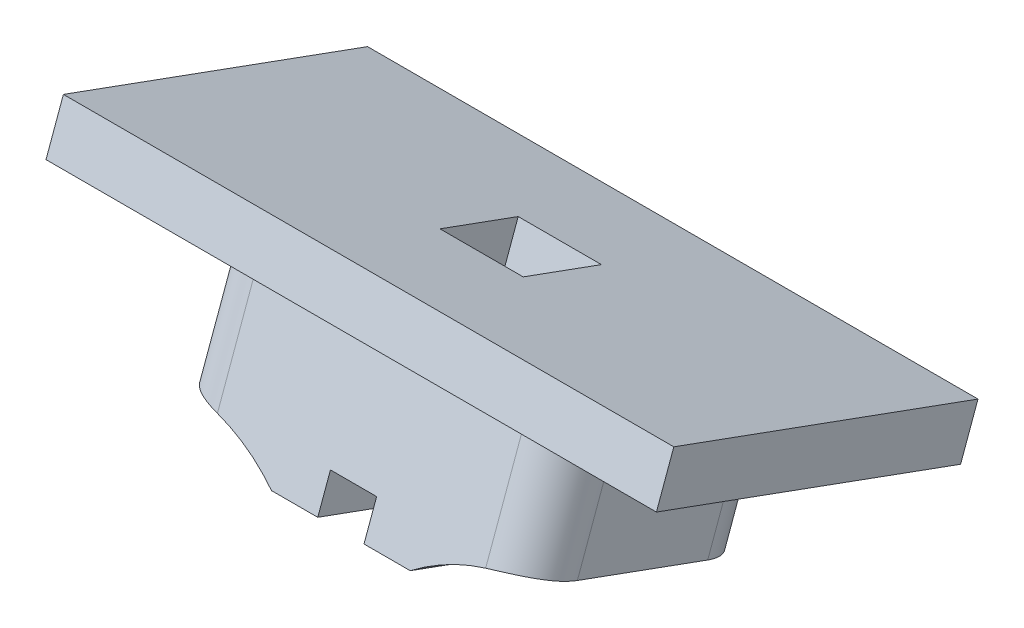
ISO-10303-21;
HEADER;
FILE_DESCRIPTION(('STEP AP214'),'2;1');
FILE_NAME('part.step','',(''),(''),'','','');
FILE_SCHEMA(('AUTOMOTIVE_DESIGN { 1 0 10303 214 1 1 1 1 }'));
ENDSEC;
DATA;
#1=APPLICATION_CONTEXT('core data for automotive mechanical design processes');
#2=APPLICATION_PROTOCOL_DEFINITION('international standard','automotive_design',2000,#1);
#3=PRODUCT_CONTEXT('',#1,'mechanical');
#4=PRODUCT('Part','Part','',(#3));
#5=PRODUCT_RELATED_PRODUCT_CATEGORY('part','',(#4));
#6=PRODUCT_DEFINITION_FORMATION('','',#4);
#7=PRODUCT_DEFINITION_CONTEXT('part definition',#1,'design');
#8=PRODUCT_DEFINITION('design','',#6,#7);
#9=PRODUCT_DEFINITION_SHAPE('','',#8);
#10=(LENGTH_UNIT() NAMED_UNIT(*) SI_UNIT(.MILLI.,.METRE.));
#11=(NAMED_UNIT(*) PLANE_ANGLE_UNIT() SI_UNIT($,.RADIAN.));
#12=(NAMED_UNIT(*) SI_UNIT($,.STERADIAN.) SOLID_ANGLE_UNIT());
#13=UNCERTAINTY_MEASURE_WITH_UNIT(LENGTH_MEASURE(1.E-05),#10,'distance_accuracy_value','');
#14=(GEOMETRIC_REPRESENTATION_CONTEXT(3) GLOBAL_UNCERTAINTY_ASSIGNED_CONTEXT((#13)) GLOBAL_UNIT_ASSIGNED_CONTEXT((#10,
#11,#12)) REPRESENTATION_CONTEXT('',''));
#15=CARTESIAN_POINT('',(0.,0.,0.));
#16=DIRECTION('',(0.,0.,1.));
#17=DIRECTION('',(1.,0.,0.));
#18=AXIS2_PLACEMENT_3D('',#15,#16,#17);
#19=CARTESIAN_POINT('',(-3.9,-153.349598056909,40.7816311231311));
#20=DIRECTION('',(0.,-0.34202014332567,-0.939692620785908));
#21=DIRECTION('',(0.,0.939692620785908,-0.34202014332567));
#22=AXIS2_PLACEMENT_3D('',#19,#20,#21);
#23=PLANE('',#22);
#24=CARTESIAN_POINT('',(2.90000000000001,-145.770988480469,38.0232428201822));
#25=DIRECTION('',(0.,-0.34202014332567,-0.939692620785908));
#26=DIRECTION('',(0.,0.939692620785908,-0.34202014332567));
#27=AXIS2_PLACEMENT_3D('',#24,#25,#26);
#28=CIRCLE('',#27,4.00000000000002);
#29=CARTESIAN_POINT('',(1.90000000000001,-142.131574609611,36.6986045010144));
#30=VERTEX_POINT('',#29);
#31=CARTESIAN_POINT('',(0.500000000000057,-142.763972093954,36.92877836154));
#32=VERTEX_POINT('',#31);
#33=EDGE_CURVE('E63',#30,#32,#28,.F.);
#34=ORIENTED_EDGE('',*,*,#33,.F.);
#35=DIRECTION('',(0.,0.939692620785908,-0.34202014332567));
#36=VECTOR('',#35,1.);
#37=CARTESIAN_POINT('',(1.90000000000001,-153.349598056909,40.7816311231311));
#38=LINE('',#37,#36);
#39=CARTESIAN_POINT('',(1.90000000000001,-139.569017183282,35.7659098742328));
#40=VERTEX_POINT('',#39);
#41=EDGE_CURVE('E368',#30,#40,#38,.T.);
#42=ORIENTED_EDGE('',*,*,#41,.T.);
#43=DIRECTION('',(-1.,0.,0.));
#44=VECTOR('',#43,1.);
#45=CARTESIAN_POINT('',(-3.9,-139.569017183282,35.7659098742328));
#46=LINE('',#45,#44);
#47=CARTESIAN_POINT('',(-3.9,-139.569017183282,35.7659098742328));
#48=VERTEX_POINT('',#47);
#49=EDGE_CURVE('E456',#40,#48,#46,.T.);
#50=ORIENTED_EDGE('',*,*,#49,.T.);
#51=DIRECTION('',(0.,0.939692620785908,-0.34202014332567));
#52=VECTOR('',#51,1.);
#53=CARTESIAN_POINT('',(-3.9,-153.349598056909,40.7816311231311));
#54=LINE('',#53,#52);
#55=CARTESIAN_POINT('',(-3.9,-142.131574609611,36.6986045010144));
#56=VERTEX_POINT('',#55);
#57=EDGE_CURVE('E459',#56,#48,#54,.T.);
#58=ORIENTED_EDGE('',*,*,#57,.F.);
#59=CARTESIAN_POINT('',(-4.9,-145.770988480469,38.0232428201822));
#60=DIRECTION('',(0.,-0.34202014332567,-0.939692620785908));
#61=DIRECTION('',(0.,0.939692620785908,-0.34202014332567));
#62=AXIS2_PLACEMENT_3D('',#59,#60,#61);
#63=CIRCLE('',#62,4.00000000000002);
#64=CARTESIAN_POINT('',(-2.5,-142.763972093954,36.92877836154));
#65=VERTEX_POINT('',#64);
#66=EDGE_CURVE('E297',#56,#65,#63,.T.);
#67=ORIENTED_EDGE('',*,*,#66,.T.);
#68=DIRECTION('',(1.,0.,0.));
#69=VECTOR('',#68,1.);
#70=CARTESIAN_POINT('',(-3.9,-142.763972093954,36.92877836154));
#71=LINE('',#70,#69);
#72=CARTESIAN_POINT('',(-1.5,-142.763972093954,36.9287783615401));
#73=VERTEX_POINT('',#72);
#74=EDGE_CURVE('E380',#65,#73,#71,.T.);
#75=ORIENTED_EDGE('',*,*,#74,.T.);
#76=DIRECTION('',(0.,0.939692620785908,-0.34202014332567));
#77=VECTOR('',#76,1.);
#78=CARTESIAN_POINT('',(-1.50000000000001,-153.349598056909,40.7816311231311));
#79=LINE('',#78,#77);
#80=CARTESIAN_POINT('',(-1.5,-142.012217997325,36.6551622468795));
#81=VERTEX_POINT('',#80);
#82=EDGE_CURVE('E430',#73,#81,#79,.T.);
#83=ORIENTED_EDGE('',*,*,#82,.T.);
#84=DIRECTION('',(1.,0.,0.));
#85=VECTOR('',#84,1.);
#86=CARTESIAN_POINT('',(-3.9,-142.012217997325,36.6551622468795));
#87=LINE('',#86,#85);
#88=CARTESIAN_POINT('',(-0.499999999999999,-142.012217997325,36.6551622468795));
#89=VERTEX_POINT('',#88);
#90=EDGE_CURVE('E437',#81,#89,#87,.T.);
#91=ORIENTED_EDGE('',*,*,#90,.T.);
#92=DIRECTION('',(0.,-0.939692620785908,0.34202014332567));
#93=VECTOR('',#92,1.);
#94=CARTESIAN_POINT('',(-0.499999999999995,-153.349598056909,40.7816311231311));
#95=LINE('',#94,#93);
#96=CARTESIAN_POINT('',(-0.499999999999998,-142.763972093954,36.9287783615401));
#97=VERTEX_POINT('',#96);
#98=EDGE_CURVE('E296',#89,#97,#95,.T.);
#99=ORIENTED_EDGE('',*,*,#98,.T.);
#100=EDGE_CURVE('E377',#97,#32,#71,.T.);
#101=ORIENTED_EDGE('',*,*,#100,.T.);
#102=EDGE_LOOP('',(#34,#42,#50,#58,#67,#75,#83,#91,#99,#101));
#103=FACE_BOUND('',#102,.T.);
#104=ADVANCED_FACE('F41',(#103),#23,.F.);
#105=CARTESIAN_POINT('',(1.90000000000001,-153.691618200234,39.8419385023452));
#106=DIRECTION('',(0.,0.939692620785908,-0.34202014332567));
#107=DIRECTION('',(0.,0.34202014332567,0.939692620785908));
#108=AXIS2_PLACEMENT_3D('',#105,#106,#107);
#109=CYLINDRICAL_SURFACE('',#108,1.);
#110=CARTESIAN_POINT('',(2.90000000000001,-142.354238140651,35.7154696260936));
#111=CARTESIAN_POINT('',(2.89999981067585,-142.344623044675,35.7418918722339));
#112=CARTESIAN_POINT('',(2.89881337849548,-142.335009168218,35.7683002326536));
#113=CARTESIAN_POINT('',(2.89408019371542,-142.315856981499,35.8209307834219));
#114=CARTESIAN_POINT('',(2.8905335481238,-142.30631866783,35.8471529821564));
#115=CARTESIAN_POINT('',(2.87638591533363,-142.277954590061,35.9252261233121));
#116=CARTESIAN_POINT('',(2.86227714579942,-142.259349628695,35.9765659550263));
#117=CARTESIAN_POINT('',(2.82509671773204,-142.223563914469,36.0764199066002));
#118=CARTESIAN_POINT('',(2.80202045019631,-142.206383899503,36.124932558613));
#119=CARTESIAN_POINT('',(2.74756694703173,-142.174361576664,36.217901329455));
#120=CARTESIAN_POINT('',(2.71619110317607,-142.159518877507,36.2623581267394));
#121=CARTESIAN_POINT('',(2.64614645015715,-142.133155653353,36.3460164020395));
#122=CARTESIAN_POINT('',(2.60749690530354,-142.121626551658,36.3852313043284));
#123=CARTESIAN_POINT('',(2.52401346901969,-142.102730718085,36.4576186109335));
#124=CARTESIAN_POINT('',(2.4791799688056,-142.095363723048,36.4907913971849));
#125=CARTESIAN_POINT('',(2.38523587109286,-142.085579727483,36.5500366389209));
#126=CARTESIAN_POINT('',(2.33617599267395,-142.083110769194,36.576181051631));
#127=CARTESIAN_POINT('',(2.23488763670893,-142.08343503558,36.6213336855982));
#128=CARTESIAN_POINT('',(2.18265966895903,-142.086227415784,36.6403430514785));
#129=CARTESIAN_POINT('',(2.0917830755058,-142.09565041477,36.6665982206708));
#130=CARTESIAN_POINT('',(2.05350236945471,-142.100961728845,36.6756523621945));
#131=CARTESIAN_POINT('',(1.97676571960946,-142.114272303601,36.6899632965396));
#132=CARTESIAN_POINT('',(1.93831017303452,-142.122267080157,36.6952263784519));
#133=CARTESIAN_POINT('',(1.90000000000001,-142.131574609611,36.6986045010144));
#134=B_SPLINE_CURVE_WITH_KNOTS('',3,(#110,#111,#112,#113,#114,#115,#116,#117,#118,#119,#120,
#121,#122,#123,#124,#125,#126,#127,#128,#129,#130,#131,#132,#133),.UNSPECIFIED.,.F.,.F.,(4,2,2,
2,2,2,2,2,2,2,2,4),(0.,0.0843002674018228,0.168596713033013,0.336929968455124,0.50534985637378,
0.673741519496261,0.841693320533725,1.00963450128944,1.17578444895358,1.34190773099849,
1.46072884894646,1.57935239450491),.UNSPECIFIED.);
#135=CARTESIAN_POINT('',(2.90000000000001,-142.354238140651,35.7154696260936));
#136=VERTEX_POINT('',#135);
#137=EDGE_CURVE('E238',#136,#30,#134,.T.);
#138=ORIENTED_EDGE('',*,*,#137,.F.);
#139=DIRECTION('',(0.,0.939692620785908,-0.34202014332567));
#140=VECTOR('',#139,1.);
#141=CARTESIAN_POINT('',(2.90000000000001,-153.691618200234,39.8419385023452));
#142=LINE('',#141,#140);
#143=CARTESIAN_POINT('',(2.90000000000001,-139.911037326607,34.8262172534469));
#144=VERTEX_POINT('',#143);
#145=EDGE_CURVE('E357',#136,#144,#142,.T.);
#146=ORIENTED_EDGE('',*,*,#145,.T.);
#147=CARTESIAN_POINT('',(1.90000000000001,-139.911037326607,34.8262172534469));
#148=DIRECTION('',(0.,-0.939692620785908,0.34202014332567));
#149=DIRECTION('',(0.,-0.34202014332567,-0.939692620785908));
#150=AXIS2_PLACEMENT_3D('',#147,#148,#149);
#151=CIRCLE('',#150,1.);
#152=EDGE_CURVE('E453',#144,#40,#151,.T.);
#153=ORIENTED_EDGE('',*,*,#152,.T.);
#154=ORIENTED_EDGE('',*,*,#41,.F.);
#155=EDGE_LOOP('',(#138,#146,#153,#154));
#156=FACE_BOUND('',#155,.T.);
#157=ADVANCED_FACE('F336',(#156),#109,.T.);
#158=CARTESIAN_POINT('',(2.90000000000001,-153.691618200234,39.8419385023452));
#159=DIRECTION('',(-1.,0.,0.));
#160=DIRECTION('',(0.,0.,1.));
#161=AXIS2_PLACEMENT_3D('',#158,#159,#160);
#162=PLANE('',#161);
#163=DIRECTION('',(0.,-0.34202014332567,-0.939692620785908));
#164=VECTOR('',#163,1.);
#165=CARTESIAN_POINT('',(2.90000000000001,-141.477555042393,38.1241366425749));
#166=LINE('',#165,#164);
#167=CARTESIAN_POINT('',(2.90000000000001,-143.380298570628,32.8963917637359));
#168=VERTEX_POINT('',#167);
#169=EDGE_CURVE('E227',#136,#168,#166,.T.);
#170=ORIENTED_EDGE('',*,*,#169,.T.);
#171=DIRECTION('',(0.,0.939692620785908,-0.34202014332567));
#172=VECTOR('',#171,1.);
#173=CARTESIAN_POINT('',(2.90000000000001,-154.717678630211,37.0228606399875));
#174=LINE('',#173,#172);
#175=CARTESIAN_POINT('',(2.90000000000001,-140.937097756584,32.0071393910891));
#176=VERTEX_POINT('',#175);
#177=EDGE_CURVE('E355',#168,#176,#174,.T.);
#178=ORIENTED_EDGE('',*,*,#177,.T.);
#179=DIRECTION('',(0.,0.342020143325671,0.939692620785907));
#180=VECTOR('',#179,1.);
#181=CARTESIAN_POINT('',(2.90000000000001,-139.911037326607,34.8262172534469));
#182=LINE('',#181,#180);
#183=EDGE_CURVE('E451',#176,#144,#182,.T.);
#184=ORIENTED_EDGE('',*,*,#183,.T.);
#185=ORIENTED_EDGE('',*,*,#145,.F.);
#186=EDGE_LOOP('',(#170,#178,#184,#185));
#187=FACE_BOUND('',#186,.T.);
#188=ADVANCED_FACE('F342',(#187),#162,.F.);
#189=CARTESIAN_POINT('',(1.90000000000001,-154.717678630211,37.0228606399875));
#190=DIRECTION('',(0.,0.939692620785908,-0.34202014332567));
#191=DIRECTION('',(0.,0.34202014332567,0.939692620785908));
#192=AXIS2_PLACEMENT_3D('',#189,#190,#191);
#193=CYLINDRICAL_SURFACE('',#192,1.);
#194=CARTESIAN_POINT('',(1.90000000000001,-143.841675326239,32.0001413970849));
#195=CARTESIAN_POINT('',(1.92716067009067,-143.83508392531,31.9977425120358));
#196=CARTESIAN_POINT('',(1.95438533042163,-143.828387941829,31.9964836997612));
#197=CARTESIAN_POINT('',(2.00879893691792,-143.814802781268,31.9962784311637));
#198=CARTESIAN_POINT('',(2.0359878772083,-143.807913575772,31.9973323167238));
#199=CARTESIAN_POINT('',(2.1171772694028,-143.787000096474,32.0040064801178));
#200=CARTESIAN_POINT('',(2.17086742578389,-143.772713783152,32.0131332563838));
#201=CARTESIAN_POINT('',(2.27572285092795,-143.743548629488,32.0406309445279));
#202=CARTESIAN_POINT('',(2.32688435389645,-143.7286689617,32.0590152130967));
#203=CARTESIAN_POINT('',(2.4249810948888,-143.698329195005,32.1044687171173));
#204=CARTESIAN_POINT('',(2.47191843255582,-143.682869389933,32.1315336069465));
#205=CARTESIAN_POINT('',(2.5593953571267,-143.651544592773,32.1929272425316));
#206=CARTESIAN_POINT('',(2.60002532695292,-143.635690047798,32.2271327800724));
#207=CARTESIAN_POINT('',(2.67458868732341,-143.603244865591,32.3019242119346));
#208=CARTESIAN_POINT('',(2.70851996169044,-143.58665399777,32.3425121152503));
#209=CARTESIAN_POINT('',(2.76889693721068,-143.552572302368,32.4290197344405));
#210=CARTESIAN_POINT('',(2.79529159893002,-143.535076244316,32.4749729669177));
#211=CARTESIAN_POINT('',(2.8395424826282,-143.499321395764,32.5705354506616));
#212=CARTESIAN_POINT('',(2.85740240658892,-143.481062939701,32.620143106009));
#213=CARTESIAN_POINT('',(2.88045893625186,-143.449024339337,32.7076735739526));
#214=CARTESIAN_POINT('',(2.88777930261012,-143.435378201366,32.7451009183088));
#215=CARTESIAN_POINT('',(2.89755144145266,-143.407928219864,32.8204800453695));
#216=CARTESIAN_POINT('',(2.90000870819365,-143.394124572045,32.8584311874049));
#217=CARTESIAN_POINT('',(2.90000000000001,-143.380298570628,32.8963917637359));
#218=B_SPLINE_CURVE_WITH_KNOTS('',3,(#194,#195,#196,#197,#198,#199,#200,#201,#202,#203,#204,
#205,#206,#207,#208,#209,#210,#211,#212,#213,#214,#215,#216,#217),.UNSPECIFIED.,.F.,.F.,(4,2,2,
2,2,2,2,2,2,2,2,4),(0.,0.0841086974099779,0.16822982933487,0.336266736171334,0.504546783958135,
0.672742719892193,0.838246322843008,1.00380212647673,1.17045386616259,1.33703325412681,
1.45826418447112,1.57935807156958),.UNSPECIFIED.);
#219=CARTESIAN_POINT('',(1.90000000000001,-143.841675326239,32.0001413970849));
#220=VERTEX_POINT('',#219);
#221=EDGE_CURVE('E230',#220,#168,#218,.T.);
#222=ORIENTED_EDGE('',*,*,#221,.F.);
#223=DIRECTION('',(0.,0.939692620785908,-0.34202014332567));
#224=VECTOR('',#223,1.);
#225=CARTESIAN_POINT('',(1.90000000000001,-155.059698773537,36.0831680192016));
#226=LINE('',#225,#224);
#227=CARTESIAN_POINT('',(1.90000000000001,-141.27911789991,31.0674467703032));
#228=VERTEX_POINT('',#227);
#229=EDGE_CURVE('E364',#220,#228,#226,.T.);
#230=ORIENTED_EDGE('',*,*,#229,.T.);
#231=CARTESIAN_POINT('',(1.90000000000001,-140.937097756584,32.0071393910891));
#232=DIRECTION('',(0.,-0.939692620785908,0.34202014332567));
#233=DIRECTION('',(0.,-0.34202014332567,-0.939692620785908));
#234=AXIS2_PLACEMENT_3D('',#231,#232,#233);
#235=CIRCLE('',#234,1.);
#236=EDGE_CURVE('E362',#228,#176,#235,.T.);
#237=ORIENTED_EDGE('',*,*,#236,.T.);
#238=ORIENTED_EDGE('',*,*,#177,.F.);
#239=EDGE_LOOP('',(#222,#230,#237,#238));
#240=FACE_BOUND('',#239,.T.);
#241=ADVANCED_FACE('F245',(#240),#193,.T.);
#242=CARTESIAN_POINT('',(-3.9,-155.059698773537,36.0831680192016));
#243=DIRECTION('',(0.,0.34202014332567,0.939692620785908));
#244=DIRECTION('',(0.,-0.939692620785908,0.34202014332567));
#245=AXIS2_PLACEMENT_3D('',#242,#243,#244);
#246=PLANE('',#245);
#247=CARTESIAN_POINT('',(2.90000000000001,-147.481089197097,33.3247797162527));
#248=DIRECTION('',(0.,0.34202014332567,0.939692620785908));
#249=DIRECTION('',(0.,0.939692620785908,-0.34202014332567));
#250=AXIS2_PLACEMENT_3D('',#247,#248,#249);
#251=CIRCLE('',#250,4.00000000000002);
#252=CARTESIAN_POINT('',(0.500000000000004,-144.474072810582,32.2303152576105));
#253=VERTEX_POINT('',#252);
#254=EDGE_CURVE('E223',#220,#253,#251,.T.);
#255=ORIENTED_EDGE('',*,*,#254,.T.);
#256=DIRECTION('',(-1.,0.,0.));
#257=VECTOR('',#256,1.);
#258=CARTESIAN_POINT('',(-3.9,-144.474072810582,32.2303152576105));
#259=LINE('',#258,#257);
#260=CARTESIAN_POINT('',(-0.5,-144.474072810582,32.2303152576105));
#261=VERTEX_POINT('',#260);
#262=EDGE_CURVE('E414',#253,#261,#259,.T.);
#263=ORIENTED_EDGE('',*,*,#262,.T.);
#264=DIRECTION('',(0.,-0.939692620785904,0.342020143325681));
#265=VECTOR('',#264,1.);
#266=CARTESIAN_POINT('',(-0.499999999999998,-144.474072810582,32.2303152576105));
#267=LINE('',#266,#265);
#268=CARTESIAN_POINT('',(-0.499999999999999,-143.722318713953,31.95669914295));
#269=VERTEX_POINT('',#268);
#270=EDGE_CURVE('E477',#269,#261,#267,.T.);
#271=ORIENTED_EDGE('',*,*,#270,.F.);
#272=DIRECTION('',(1.,0.,0.));
#273=VECTOR('',#272,1.);
#274=CARTESIAN_POINT('',(-1.5,-143.722318713953,31.95669914295));
#275=LINE('',#274,#273);
#276=CARTESIAN_POINT('',(-1.5,-143.722318713953,31.95669914295));
#277=VERTEX_POINT('',#276);
#278=EDGE_CURVE('E485',#277,#269,#275,.T.);
#279=ORIENTED_EDGE('',*,*,#278,.F.);
#280=DIRECTION('',(0.,0.939692620785904,-0.342020143325681));
#281=VECTOR('',#280,1.);
#282=CARTESIAN_POINT('',(-1.5,-144.474072810582,32.2303152576105));
#283=LINE('',#282,#281);
#284=CARTESIAN_POINT('',(-1.5,-144.474072810582,32.2303152576105));
#285=VERTEX_POINT('',#284);
#286=EDGE_CURVE('E484',#285,#277,#283,.T.);
#287=ORIENTED_EDGE('',*,*,#286,.F.);
#288=CARTESIAN_POINT('',(-2.5,-144.474072810582,32.2303152576105));
#289=VERTEX_POINT('',#288);
#290=EDGE_CURVE('E424',#285,#289,#259,.T.);
#291=ORIENTED_EDGE('',*,*,#290,.T.);
#292=CARTESIAN_POINT('',(-4.9,-147.481089197097,33.3247797162527));
#293=DIRECTION('',(0.,-0.34202014332567,-0.939692620785908));
#294=DIRECTION('',(0.,0.939692620785908,-0.34202014332567));
#295=AXIS2_PLACEMENT_3D('',#292,#293,#294);
#296=CIRCLE('',#295,4.00000000000002);
#297=CARTESIAN_POINT('',(-3.9,-143.841675326239,32.0001413970849));
#298=VERTEX_POINT('',#297);
#299=EDGE_CURVE('E483',#298,#289,#296,.T.);
#300=ORIENTED_EDGE('',*,*,#299,.F.);
#301=DIRECTION('',(0.,0.939692620785908,-0.34202014332567));
#302=VECTOR('',#301,1.);
#303=CARTESIAN_POINT('',(-3.9,-155.059698773537,36.0831680192016));
#304=LINE('',#303,#302);
#305=CARTESIAN_POINT('',(-3.9,-141.27911789991,31.0674467703032));
#306=VERTEX_POINT('',#305);
#307=EDGE_CURVE('E366',#298,#306,#304,.T.);
#308=ORIENTED_EDGE('',*,*,#307,.T.);
#309=DIRECTION('',(1.,0.,0.));
#310=VECTOR('',#309,1.);
#311=CARTESIAN_POINT('',(-3.9,-141.27911789991,31.0674467703032));
#312=LINE('',#311,#310);
#313=EDGE_CURVE('E447',#306,#228,#312,.T.);
#314=ORIENTED_EDGE('',*,*,#313,.T.);
#315=ORIENTED_EDGE('',*,*,#229,.F.);
#316=EDGE_LOOP('',(#255,#263,#271,#279,#287,#291,#300,#308,#314,#315));
#317=FACE_BOUND('',#316,.T.);
#318=ADVANCED_FACE('F305',(#317),#246,.F.);
#319=CARTESIAN_POINT('',(23.45,-146.543294677702,26.5451749018557));
#320=DIRECTION('',(0.,0.939692620785909,-0.342020143325668));
#321=DIRECTION('',(0.,0.342020143325668,0.939692620785909));
#322=AXIS2_PLACEMENT_3D('',#319,#320,#321);
#323=PLANE('',#322);
#324=DIRECTION('',(0.,-0.34202014332567,-0.939692620785908));
#325=VECTOR('',#324,1.);
#326=CARTESIAN_POINT('',(0.500000000000056,-142.229309139021,38.3977527572354));
#327=LINE('',#326,#325);
#328=EDGE_CURVE('E12',#32,#253,#327,.T.);
#329=ORIENTED_EDGE('',*,*,#328,.F.);
#330=ORIENTED_EDGE('',*,*,#100,.F.);
#331=DIRECTION('',(0.,-0.342020143325668,-0.939692620785909));
#332=VECTOR('',#331,1.);
#333=CARTESIAN_POINT('',(-0.499999999999997,-146.543294677702,26.5451749018557));
#334=LINE('',#333,#332);
#335=EDGE_CURVE('E417',#97,#261,#334,.T.);
#336=ORIENTED_EDGE('',*,*,#335,.T.);
#337=ORIENTED_EDGE('',*,*,#262,.F.);
#338=EDGE_LOOP('',(#329,#330,#336,#337));
#339=FACE_BOUND('',#338,.T.);
#340=ADVANCED_FACE('F275',(#339),#323,.F.);
#341=ORIENTED_EDGE('',*,*,#290,.F.);
#342=DIRECTION('',(0.,0.342020143325668,0.939692620785909));
#343=VECTOR('',#342,1.);
#344=CARTESIAN_POINT('',(-1.5,-146.543294677702,26.5451749018557));
#345=LINE('',#344,#343);
#346=EDGE_CURVE('E49',#285,#73,#345,.T.);
#347=ORIENTED_EDGE('',*,*,#346,.T.);
#348=ORIENTED_EDGE('',*,*,#74,.F.);
#349=DIRECTION('',(0.,-0.34202014332567,-0.939692620785908));
#350=VECTOR('',#349,1.);
#351=CARTESIAN_POINT('',(-2.49999999999982,-116.719514672784,108.48533702815));
#352=LINE('',#351,#350);
#353=EDGE_CURVE('E401',#65,#289,#352,.T.);
#354=ORIENTED_EDGE('',*,*,#353,.T.);
#355=EDGE_LOOP('',(#341,#347,#348,#354));
#356=FACE_BOUND('',#355,.T.);
#357=ADVANCED_FACE('F327',(#356),#323,.F.);
#358=CARTESIAN_POINT('',(5.6,-155.849229014604,35.3063557535272));
#359=DIRECTION('',(-1.,0.,0.));
#360=DIRECTION('',(0.,0.,1.));
#361=AXIS2_PLACEMENT_3D('',#358,#359,#360);
#362=PLANE('',#361);
#363=DIRECTION('',(0.,0.34202014332567,0.939692620785908));
#364=VECTOR('',#363,1.);
#365=CARTESIAN_POINT('',(5.6,-141.621138043236,30.1277541495173));
#366=LINE('',#365,#364);
#367=CARTESIAN_POINT('',(5.6,-141.621138043236,30.1277541495173));
#368=VERTEX_POINT('',#367);
#369=CARTESIAN_POINT('',(5.6,-139.226997039956,36.7056024950187));
#370=VERTEX_POINT('',#369);
#371=EDGE_CURVE('E405',#368,#370,#366,.T.);
#372=ORIENTED_EDGE('',*,*,#371,.F.);
#373=DIRECTION('',(0.,0.939692620785908,-0.342020143325669));
#374=VECTOR('',#373,1.);
#375=CARTESIAN_POINT('',(5.6,-155.849229014604,35.3063557535272));
#376=LINE('',#375,#374);
#377=CARTESIAN_POINT('',(5.6,-140.587476160371,29.7515319918591));
#378=VERTEX_POINT('',#377);
#379=EDGE_CURVE('E397',#368,#378,#376,.T.);
#380=ORIENTED_EDGE('',*,*,#379,.T.);
#381=DIRECTION('',(0.,0.34202014332567,0.939692620785908));
#382=VECTOR('',#381,1.);
#383=CARTESIAN_POINT('',(5.6,-140.587476160371,29.7515319918591));
#384=LINE('',#383,#382);
#385=CARTESIAN_POINT('',(5.6,-138.193335157091,36.3293803373605));
#386=VERTEX_POINT('',#385);
#387=EDGE_CURVE('E394',#378,#386,#384,.T.);
#388=ORIENTED_EDGE('',*,*,#387,.T.);
#389=DIRECTION('',(0.,0.939692620785908,-0.342020143325669));
#390=VECTOR('',#389,1.);
#391=CARTESIAN_POINT('',(5.6,-153.455088011325,41.8842040990286));
#392=LINE('',#391,#390);
#393=EDGE_CURVE('E393',#370,#386,#392,.T.);
#394=ORIENTED_EDGE('',*,*,#393,.F.);
#395=EDGE_LOOP('',(#372,#380,#388,#394));
#396=FACE_BOUND('',#395,.T.);
#397=ADVANCED_FACE('F324',(#396),#362,.F.);
#398=CARTESIAN_POINT('',(5.6,-153.455088011325,41.8842040990286));
#399=DIRECTION('',(0.,-0.342020143325669,-0.939692620785908));
#400=DIRECTION('',(0.,0.939692620785908,-0.342020143325669));
#401=AXIS2_PLACEMENT_3D('',#398,#399,#400);
#402=PLANE('',#401);
#403=DIRECTION('',(-1.,0.,0.));
#404=VECTOR('',#403,1.);
#405=CARTESIAN_POINT('',(5.6,-139.226997039956,36.7056024950187));
#406=LINE('',#405,#404);
#407=CARTESIAN_POINT('',(-7.6,-139.226997039956,36.7056024950187));
#408=VERTEX_POINT('',#407);
#409=EDGE_CURVE('E402',#370,#408,#406,.T.);
#410=ORIENTED_EDGE('',*,*,#409,.F.);
#411=ORIENTED_EDGE('',*,*,#393,.T.);
#412=DIRECTION('',(-1.,0.,0.));
#413=VECTOR('',#412,1.);
#414=CARTESIAN_POINT('',(5.6,-138.193335157091,36.3293803373605));
#415=LINE('',#414,#413);
#416=CARTESIAN_POINT('',(-7.6,-138.193335157091,36.3293803373605));
#417=VERTEX_POINT('',#416);
#418=EDGE_CURVE('E390',#386,#417,#415,.T.);
#419=ORIENTED_EDGE('',*,*,#418,.T.);
#420=DIRECTION('',(0.,0.939692620785908,-0.342020143325669));
#421=VECTOR('',#420,1.);
#422=CARTESIAN_POINT('',(-7.6,-153.455088011325,41.8842040990286));
#423=LINE('',#422,#421);
#424=EDGE_CURVE('E389',#408,#417,#423,.T.);
#425=ORIENTED_EDGE('',*,*,#424,.F.);
#426=EDGE_LOOP('',(#410,#411,#419,#425));
#427=FACE_BOUND('',#426,.T.);
#428=ADVANCED_FACE('F321',(#427),#402,.F.);
#429=CARTESIAN_POINT('',(-7.6,-155.849229014604,35.3063557535272));
#430=DIRECTION('',(1.,0.,0.));
#431=DIRECTION('',(0.,0.,-1.));
#432=AXIS2_PLACEMENT_3D('',#429,#430,#431);
#433=PLANE('',#432);
#434=DIRECTION('',(0.,-0.34202014332567,-0.939692620785908));
#435=VECTOR('',#434,1.);
#436=CARTESIAN_POINT('',(-7.6,-141.621138043236,30.1277541495173));
#437=LINE('',#436,#435);
#438=CARTESIAN_POINT('',(-7.6,-141.621138043236,30.1277541495173));
#439=VERTEX_POINT('',#438);
#440=EDGE_CURVE('E398',#408,#439,#437,.T.);
#441=ORIENTED_EDGE('',*,*,#440,.F.);
#442=ORIENTED_EDGE('',*,*,#424,.T.);
#443=DIRECTION('',(0.,-0.34202014332567,-0.939692620785908));
#444=VECTOR('',#443,1.);
#445=CARTESIAN_POINT('',(-7.6,-140.587476160371,29.7515319918591));
#446=LINE('',#445,#444);
#447=CARTESIAN_POINT('',(-7.6,-140.587476160371,29.7515319918591));
#448=VERTEX_POINT('',#447);
#449=EDGE_CURVE('E386',#417,#448,#446,.T.);
#450=ORIENTED_EDGE('',*,*,#449,.T.);
#451=DIRECTION('',(0.,0.939692620785908,-0.342020143325669));
#452=VECTOR('',#451,1.);
#453=CARTESIAN_POINT('',(-7.6,-155.849229014604,35.3063557535272));
#454=LINE('',#453,#452);
#455=EDGE_CURVE('E385',#439,#448,#454,.T.);
#456=ORIENTED_EDGE('',*,*,#455,.F.);
#457=EDGE_LOOP('',(#441,#442,#450,#456));
#458=FACE_BOUND('',#457,.T.);
#459=ADVANCED_FACE('F317',(#458),#433,.F.);
#460=CARTESIAN_POINT('',(5.6,-155.849229014604,35.3063557535272));
#461=DIRECTION('',(0.,0.342020143325669,0.939692620785908));
#462=DIRECTION('',(0.,-0.939692620785908,0.342020143325669));
#463=AXIS2_PLACEMENT_3D('',#460,#461,#462);
#464=PLANE('',#463);
#465=DIRECTION('',(1.,0.,0.));
#466=VECTOR('',#465,1.);
#467=CARTESIAN_POINT('',(5.6,-141.621138043236,30.1277541495173));
#468=LINE('',#467,#466);
#469=EDGE_CURVE('E384',#439,#368,#468,.T.);
#470=ORIENTED_EDGE('',*,*,#469,.F.);
#471=ORIENTED_EDGE('',*,*,#455,.T.);
#472=DIRECTION('',(1.,0.,0.));
#473=VECTOR('',#472,1.);
#474=CARTESIAN_POINT('',(5.6,-140.587476160371,29.7515319918591));
#475=LINE('',#474,#473);
#476=EDGE_CURVE('E381',#448,#378,#475,.T.);
#477=ORIENTED_EDGE('',*,*,#476,.T.);
#478=ORIENTED_EDGE('',*,*,#379,.F.);
#479=EDGE_LOOP('',(#470,#471,#477,#478));
#480=FACE_BOUND('',#479,.T.);
#481=ADVANCED_FACE('F314',(#480),#464,.F.);
#482=CARTESIAN_POINT('',(0.,-133.703823589352,48.6642119941038));
#483=DIRECTION('',(0.,-0.939692620785908,0.34202014332567));
#484=DIRECTION('',(0.,-0.34202014332567,-0.939692620785908));
#485=AXIS2_PLACEMENT_3D('',#482,#483,#484);
#486=PLANE('',#485);
#487=DIRECTION('',(1.,0.,0.));
#488=VECTOR('',#487,1.);
#489=CARTESIAN_POINT('',(-1.90000000000001,-139.082587529738,33.8861795233171));
#490=LINE('',#489,#488);
#491=CARTESIAN_POINT('',(-1.90000000000001,-139.082587529738,33.8861795233171));
#492=VERTEX_POINT('',#491);
#493=CARTESIAN_POINT('',(-0.0999999999999847,-139.082587529738,33.8861795233171));
#494=VERTEX_POINT('',#493);
#495=EDGE_CURVE('E205',#492,#494,#490,.T.);
#496=ORIENTED_EDGE('',*,*,#495,.F.);
#497=DIRECTION('',(0.,0.342020143325672,0.939692620785907));
#498=VECTOR('',#497,1.);
#499=CARTESIAN_POINT('',(-1.90000000000001,-139.082587529738,33.8861795233171));
#500=LINE('',#499,#498);
#501=CARTESIAN_POINT('',(-1.9,-139.698223787724,32.1947328059024));
#502=VERTEX_POINT('',#501);
#503=EDGE_CURVE('E56',#502,#492,#500,.T.);
#504=ORIENTED_EDGE('',*,*,#503,.F.);
#505=DIRECTION('',(-1.,0.,0.));
#506=VECTOR('',#505,1.);
#507=CARTESIAN_POINT('',(-1.9,-139.698223787724,32.1947328059024));
#508=LINE('',#507,#506);
#509=CARTESIAN_POINT('',(-0.0999999999999847,-139.698223787724,32.1947328059024));
#510=VERTEX_POINT('',#509);
#511=EDGE_CURVE('E212',#510,#502,#508,.T.);
#512=ORIENTED_EDGE('',*,*,#511,.F.);
#513=DIRECTION('',(0.,-0.342020143325671,-0.939692620785908));
#514=VECTOR('',#513,1.);
#515=CARTESIAN_POINT('',(-0.0999999999999847,-139.082587529738,33.8861795233171));
#516=LINE('',#515,#514);
#517=EDGE_CURVE('E195',#494,#510,#516,.T.);
#518=ORIENTED_EDGE('',*,*,#517,.F.);
#519=EDGE_LOOP('',(#496,#504,#512,#518));
#520=FACE_BOUND('',#519,.T.);
#521=ORIENTED_EDGE('',*,*,#387,.F.);
#522=ORIENTED_EDGE('',*,*,#476,.F.);
#523=ORIENTED_EDGE('',*,*,#449,.F.);
#524=ORIENTED_EDGE('',*,*,#418,.F.);
#525=EDGE_LOOP('',(#521,#522,#523,#524));
#526=FACE_BOUND('',#525,.T.);
#527=ADVANCED_FACE('F209',(#520,#526),#486,.F.);
#528=CARTESIAN_POINT('',(0.,-134.737485472217,49.040434151762));
#529=DIRECTION('',(0.,-0.939692620785908,0.34202014332567));
#530=DIRECTION('',(0.,-0.34202014332567,-0.939692620785908));
#531=AXIS2_PLACEMENT_3D('',#528,#529,#530);
#532=PLANE('',#531);
#533=CARTESIAN_POINT('',(-3.9,-139.911037326607,34.8262172534469));
#534=DIRECTION('',(0.,-0.939692620785908,0.34202014332567));
#535=DIRECTION('',(0.,-0.34202014332567,-0.939692620785908));
#536=AXIS2_PLACEMENT_3D('',#533,#534,#535);
#537=CIRCLE('',#536,1.);
#538=CARTESIAN_POINT('',(-4.9,-139.911037326607,34.8262172534469));
#539=VERTEX_POINT('',#538);
#540=EDGE_CURVE('E438',#48,#539,#537,.T.);
#541=ORIENTED_EDGE('',*,*,#540,.F.);
#542=ORIENTED_EDGE('',*,*,#49,.F.);
#543=ORIENTED_EDGE('',*,*,#152,.F.);
#544=ORIENTED_EDGE('',*,*,#183,.F.);
#545=ORIENTED_EDGE('',*,*,#236,.F.);
#546=ORIENTED_EDGE('',*,*,#313,.F.);
#547=CARTESIAN_POINT('',(-3.9,-140.937097756584,32.0071393910891));
#548=DIRECTION('',(0.,-0.939692620785908,0.34202014332567));
#549=DIRECTION('',(0.,-0.34202014332567,-0.939692620785908));
#550=AXIS2_PLACEMENT_3D('',#547,#548,#549);
#551=CIRCLE('',#550,1.);
#552=CARTESIAN_POINT('',(-4.9,-140.937097756584,32.0071393910891));
#553=VERTEX_POINT('',#552);
#554=EDGE_CURVE('E444',#553,#306,#551,.T.);
#555=ORIENTED_EDGE('',*,*,#554,.F.);
#556=DIRECTION('',(0.,-0.342020143325671,-0.939692620785907));
#557=VECTOR('',#556,1.);
#558=CARTESIAN_POINT('',(-4.9,-139.911037326607,34.8262172534469));
#559=LINE('',#558,#557);
#560=EDGE_CURVE('E441',#539,#553,#559,.T.);
#561=ORIENTED_EDGE('',*,*,#560,.F.);
#562=EDGE_LOOP('',(#541,#542,#543,#544,#545,#546,#555,#561));
#563=FACE_BOUND('',#562,.T.);
#564=ORIENTED_EDGE('',*,*,#469,.T.);
#565=ORIENTED_EDGE('',*,*,#371,.T.);
#566=ORIENTED_EDGE('',*,*,#409,.T.);
#567=ORIENTED_EDGE('',*,*,#440,.T.);
#568=EDGE_LOOP('',(#564,#565,#566,#567));
#569=FACE_BOUND('',#568,.T.);
#570=ADVANCED_FACE('F43',(#563,#569),#532,.T.);
#571=CARTESIAN_POINT('',(-3.9,-154.717678630211,37.0228606399875));
#572=DIRECTION('',(0.,0.939692620785908,-0.34202014332567));
#573=DIRECTION('',(0.,0.34202014332567,0.939692620785908));
#574=AXIS2_PLACEMENT_3D('',#571,#572,#573);
#575=CYLINDRICAL_SURFACE('',#574,1.);
#576=ORIENTED_EDGE('',*,*,#307,.F.);
#577=CARTESIAN_POINT('',(-3.9,-143.841675326239,32.0001413970849));
#578=CARTESIAN_POINT('',(-3.92716067009066,-143.83508392531,31.9977425120358));
#579=CARTESIAN_POINT('',(-3.95438533042162,-143.828387941829,31.9964836997612));
#580=CARTESIAN_POINT('',(-4.00879893691792,-143.814802781268,31.9962784311637));
#581=CARTESIAN_POINT('',(-4.03598787720829,-143.807913575772,31.9973323167238));
#582=CARTESIAN_POINT('',(-4.11717726940279,-143.787000096474,32.0040064801178));
#583=CARTESIAN_POINT('',(-4.17086742578388,-143.772713783152,32.0131332563838));
#584=CARTESIAN_POINT('',(-4.27572285092794,-143.743548629488,32.0406309445279));
#585=CARTESIAN_POINT('',(-4.32688435389644,-143.7286689617,32.0590152130967));
#586=CARTESIAN_POINT('',(-4.42498109488879,-143.698329195005,32.1044687171173));
#587=CARTESIAN_POINT('',(-4.47191843255581,-143.682869389933,32.1315336069465));
#588=CARTESIAN_POINT('',(-4.55939535712669,-143.651544592773,32.1929272425316));
#589=CARTESIAN_POINT('',(-4.60002532695291,-143.635690047798,32.2271327800724));
#590=CARTESIAN_POINT('',(-4.67458868732341,-143.603244865591,32.3019242119346));
#591=CARTESIAN_POINT('',(-4.70851996169043,-143.58665399777,32.3425121152503));
#592=CARTESIAN_POINT('',(-4.76889693721067,-143.552572302368,32.4290197344405));
#593=CARTESIAN_POINT('',(-4.79529159893002,-143.535076244316,32.4749729669177));
#594=CARTESIAN_POINT('',(-4.8395424826282,-143.499321395764,32.5705354506616));
#595=CARTESIAN_POINT('',(-4.85740240658891,-143.481062939701,32.620143106009));
#596=CARTESIAN_POINT('',(-4.88045893625185,-143.449024339337,32.7076735739526));
#597=CARTESIAN_POINT('',(-4.88777930261011,-143.435378201366,32.7451009183088));
#598=CARTESIAN_POINT('',(-4.89755144145266,-143.407928219864,32.8204800453695));
#599=CARTESIAN_POINT('',(-4.90000870819364,-143.394124572045,32.8584311874049));
#600=CARTESIAN_POINT('',(-4.9,-143.380298570628,32.8963917637359));
#601=B_SPLINE_CURVE_WITH_KNOTS('',3,(#577,#578,#579,#580,#581,#582,#583,#584,#585,#586,#587,
#588,#589,#590,#591,#592,#593,#594,#595,#596,#597,#598,#599,#600),.UNSPECIFIED.,.F.,.F.,(4,2,2,
2,2,2,2,2,2,2,2,4),(0.,0.084108697409976,0.168229829334868,0.336266736171333,0.504546783958127,
0.672742719892193,0.838246322843019,1.00380212647673,1.17045386616259,1.33703325412681,
1.45826418447113,1.57935807156959),.UNSPECIFIED.);
#602=CARTESIAN_POINT('',(-4.9,-143.380298570628,32.8963917637359));
#603=VERTEX_POINT('',#602);
#604=EDGE_CURVE('E288',#298,#603,#601,.T.);
#605=ORIENTED_EDGE('',*,*,#604,.T.);
#606=DIRECTION('',(0.,0.939692620785908,-0.34202014332567));
#607=VECTOR('',#606,1.);
#608=CARTESIAN_POINT('',(-4.90000000000001,-154.717678630211,37.0228606399875));
#609=LINE('',#608,#607);
#610=EDGE_CURVE('E373',#603,#553,#609,.T.);
#611=ORIENTED_EDGE('',*,*,#610,.T.);
#612=ORIENTED_EDGE('',*,*,#554,.T.);
#613=EDGE_LOOP('',(#576,#605,#611,#612));
#614=FACE_BOUND('',#613,.T.);
#615=ADVANCED_FACE('F299',(#614),#575,.T.);
#616=CARTESIAN_POINT('',(-4.90000000000001,-153.691618200234,39.8419385023452));
#617=DIRECTION('',(1.,0.,0.));
#618=DIRECTION('',(0.,1.,0.));
#619=AXIS2_PLACEMENT_3D('',#616,#617,#618);
#620=PLANE('',#619);
#621=ORIENTED_EDGE('',*,*,#610,.F.);
#622=DIRECTION('',(0.,-0.34202014332567,-0.939692620785908));
#623=VECTOR('',#622,1.);
#624=CARTESIAN_POINT('',(-4.9,-115.967760576156,108.21172091349));
#625=LINE('',#624,#623);
#626=CARTESIAN_POINT('',(-4.9,-142.354238140651,35.7154696260936));
#627=VERTEX_POINT('',#626);
#628=EDGE_CURVE('E482',#627,#603,#625,.T.);
#629=ORIENTED_EDGE('',*,*,#628,.F.);
#630=DIRECTION('',(0.,0.939692620785908,-0.34202014332567));
#631=VECTOR('',#630,1.);
#632=CARTESIAN_POINT('',(-4.90000000000001,-153.691618200234,39.8419385023452));
#633=LINE('',#632,#631);
#634=EDGE_CURVE('E375',#627,#539,#633,.T.);
#635=ORIENTED_EDGE('',*,*,#634,.T.);
#636=ORIENTED_EDGE('',*,*,#560,.T.);
#637=EDGE_LOOP('',(#621,#629,#635,#636));
#638=FACE_BOUND('',#637,.T.);
#639=ADVANCED_FACE('F303',(#638),#620,.F.);
#640=CARTESIAN_POINT('',(-3.9,-153.691618200234,39.8419385023452));
#641=DIRECTION('',(0.,0.939692620785908,-0.34202014332567));
#642=DIRECTION('',(0.,0.34202014332567,0.939692620785908));
#643=AXIS2_PLACEMENT_3D('',#640,#641,#642);
#644=CYLINDRICAL_SURFACE('',#643,1.);
#645=ORIENTED_EDGE('',*,*,#634,.F.);
#646=CARTESIAN_POINT('',(-4.9,-142.354238140651,35.7154696260936));
#647=CARTESIAN_POINT('',(-4.89999981067584,-142.344623044675,35.7418918722339));
#648=CARTESIAN_POINT('',(-4.89881337849547,-142.335009168218,35.7683002326536));
#649=CARTESIAN_POINT('',(-4.89408019371541,-142.315856981499,35.8209307834219));
#650=CARTESIAN_POINT('',(-4.89053354812379,-142.30631866783,35.8471529821564));
#651=CARTESIAN_POINT('',(-4.87638591533363,-142.277954590061,35.9252261233121));
#652=CARTESIAN_POINT('',(-4.86227714579941,-142.259349628695,35.9765659550263));
#653=CARTESIAN_POINT('',(-4.82509671773204,-142.223563914469,36.0764199066002));
#654=CARTESIAN_POINT('',(-4.80202045019631,-142.206383899503,36.124932558613));
#655=CARTESIAN_POINT('',(-4.74756694703174,-142.174361576664,36.2179013294549));
#656=CARTESIAN_POINT('',(-4.71619110317608,-142.159518877507,36.2623581267394));
#657=CARTESIAN_POINT('',(-4.64614645015715,-142.133155653353,36.3460164020395));
#658=CARTESIAN_POINT('',(-4.60749690530354,-142.121626551658,36.3852313043284));
#659=CARTESIAN_POINT('',(-4.52401346901969,-142.102730718085,36.4576186109335));
#660=CARTESIAN_POINT('',(-4.4791799688056,-142.095363723048,36.4907913971849));
#661=CARTESIAN_POINT('',(-4.38523587109286,-142.085579727483,36.5500366389209));
#662=CARTESIAN_POINT('',(-4.33617599267395,-142.083110769194,36.576181051631));
#663=CARTESIAN_POINT('',(-4.23488763670893,-142.08343503558,36.6213336855982));
#664=CARTESIAN_POINT('',(-4.18265966895903,-142.086227415784,36.6403430514785));
#665=CARTESIAN_POINT('',(-4.0917830755058,-142.09565041477,36.6665982206708));
#666=CARTESIAN_POINT('',(-4.05350236945471,-142.100961728845,36.6756523621945));
#667=CARTESIAN_POINT('',(-3.97676571960945,-142.114272303601,36.6899632965396));
#668=CARTESIAN_POINT('',(-3.93831017303451,-142.122267080157,36.6952263784519));
#669=CARTESIAN_POINT('',(-3.9,-142.131574609611,36.6986045010144));
#670=B_SPLINE_CURVE_WITH_KNOTS('',3,(#646,#647,#648,#649,#650,#651,#652,#653,#654,#655,#656,
#657,#658,#659,#660,#661,#662,#663,#664,#665,#666,#667,#668,#669),.UNSPECIFIED.,.F.,.F.,(4,2,2,
2,2,2,2,2,2,2,2,4),(0.,0.0843002674018293,0.168596713033019,0.336929968455117,0.505349856373772,
0.673741519496251,0.841693320533725,1.00963450128944,1.17578444895358,1.34190773099848,
1.46072884894647,1.57935239450492),.UNSPECIFIED.);
#671=EDGE_CURVE('E279',#627,#56,#670,.T.);
#672=ORIENTED_EDGE('',*,*,#671,.T.);
#673=ORIENTED_EDGE('',*,*,#57,.T.);
#674=ORIENTED_EDGE('',*,*,#540,.T.);
#675=EDGE_LOOP('',(#645,#672,#673,#674));
#676=FACE_BOUND('',#675,.T.);
#677=ADVANCED_FACE('F273',(#676),#644,.T.);
#678=CARTESIAN_POINT('',(-4.9,-119.726531059299,109.579801486792));
#679=DIRECTION('',(0.,-0.34202014332567,-0.939692620785908));
#680=DIRECTION('',(0.,0.939692620785908,-0.34202014332567));
#681=AXIS2_PLACEMENT_3D('',#678,#679,#680);
#682=CYLINDRICAL_SURFACE('',#681,4.00000000000002);
#683=ORIENTED_EDGE('',*,*,#299,.T.);
#684=ORIENTED_EDGE('',*,*,#353,.F.);
#685=ORIENTED_EDGE('',*,*,#66,.F.);
#686=ORIENTED_EDGE('',*,*,#671,.F.);
#687=ORIENTED_EDGE('',*,*,#628,.T.);
#688=ORIENTED_EDGE('',*,*,#604,.F.);
#689=EDGE_LOOP('',(#683,#684,#685,#686,#687,#688));
#690=FACE_BOUND('',#689,.T.);
#691=ADVANCED_FACE('F265',(#690),#682,.F.);
#692=CARTESIAN_POINT('',(-1.5,-115.967760576156,108.21172091349));
#693=DIRECTION('',(0.,0.939692620785908,-0.34202014332567));
#694=DIRECTION('',(0.,0.34202014332567,0.939692620785908));
#695=AXIS2_PLACEMENT_3D('',#692,#693,#694);
#696=PLANE('',#695);
#697=DIRECTION('',(0.,-0.34202014332567,-0.939692620785908));
#698=VECTOR('',#697,1.);
#699=CARTESIAN_POINT('',(-1.5,-115.967760576156,108.21172091349));
#700=LINE('',#699,#698);
#701=EDGE_CURVE('E472',#81,#277,#700,.T.);
#702=ORIENTED_EDGE('',*,*,#701,.T.);
#703=ORIENTED_EDGE('',*,*,#278,.T.);
#704=DIRECTION('',(0.,-0.34202014332567,-0.939692620785908));
#705=VECTOR('',#704,1.);
#706=CARTESIAN_POINT('',(-0.499999999999999,-115.967760576156,108.21172091349));
#707=LINE('',#706,#705);
#708=EDGE_CURVE('E471',#89,#269,#707,.T.);
#709=ORIENTED_EDGE('',*,*,#708,.F.);
#710=ORIENTED_EDGE('',*,*,#90,.F.);
#711=EDGE_LOOP('',(#702,#703,#709,#710));
#712=FACE_BOUND('',#711,.T.);
#713=ADVANCED_FACE('F262',(#712),#696,.F.);
#714=CARTESIAN_POINT('',(-1.5,-116.719514672784,108.48533702815));
#715=DIRECTION('',(-1.,0.,0.));
#716=DIRECTION('',(0.,-1.,0.));
#717=AXIS2_PLACEMENT_3D('',#714,#715,#716);
#718=PLANE('',#717);
#719=ORIENTED_EDGE('',*,*,#346,.F.);
#720=ORIENTED_EDGE('',*,*,#286,.T.);
#721=ORIENTED_EDGE('',*,*,#701,.F.);
#722=ORIENTED_EDGE('',*,*,#82,.F.);
#723=EDGE_LOOP('',(#719,#720,#721,#722));
#724=FACE_BOUND('',#723,.T.);
#725=ADVANCED_FACE('F260',(#724),#718,.F.);
#726=CARTESIAN_POINT('',(-0.499999999999998,-116.719514672784,108.48533702815));
#727=DIRECTION('',(1.,0.,0.));
#728=DIRECTION('',(0.,1.,0.));
#729=AXIS2_PLACEMENT_3D('',#726,#727,#728);
#730=PLANE('',#729);
#731=ORIENTED_EDGE('',*,*,#708,.T.);
#732=ORIENTED_EDGE('',*,*,#270,.T.);
#733=ORIENTED_EDGE('',*,*,#335,.F.);
#734=ORIENTED_EDGE('',*,*,#98,.F.);
#735=EDGE_LOOP('',(#731,#732,#733,#734));
#736=FACE_BOUND('',#735,.T.);
#737=ADVANCED_FACE('F255',(#736),#730,.F.);
#738=CARTESIAN_POINT('',(2.90000000000001,-145.236325525536,39.4922172158776));
#739=DIRECTION('',(0.,-0.34202014332567,-0.939692620785908));
#740=DIRECTION('',(0.,0.939692620785908,-0.34202014332567));
#741=AXIS2_PLACEMENT_3D('',#738,#739,#740);
#742=CYLINDRICAL_SURFACE('',#741,4.00000000000002);
#743=ORIENTED_EDGE('',*,*,#33,.T.);
#744=ORIENTED_EDGE('',*,*,#328,.T.);
#745=ORIENTED_EDGE('',*,*,#254,.F.);
#746=ORIENTED_EDGE('',*,*,#221,.T.);
#747=ORIENTED_EDGE('',*,*,#169,.F.);
#748=ORIENTED_EDGE('',*,*,#137,.T.);
#749=EDGE_LOOP('',(#743,#744,#745,#746,#747,#748));
#750=FACE_BOUND('',#749,.T.);
#751=ADVANCED_FACE('F249',(#750),#742,.F.);
#752=CARTESIAN_POINT('',(-1.90000000000001,-144.951517114445,36.0222951991548));
#753=DIRECTION('',(-1.,0.,0.));
#754=DIRECTION('',(0.,0.,1.));
#755=AXIS2_PLACEMENT_3D('',#752,#753,#754);
#756=PLANE('',#755);
#757=DIRECTION('',(0.,-0.34202014332567,-0.939692620785908));
#758=VECTOR('',#757,1.);
#759=CARTESIAN_POINT('',(-1.90000000000001,-142.089603916253,34.9806439819592));
#760=LINE('',#759,#758);
#761=CARTESIAN_POINT('',(-1.90000000000001,-142.089603916253,34.9806439819592));
#762=VERTEX_POINT('',#761);
#763=CARTESIAN_POINT('',(-1.9,-142.705240174239,33.2891972645446));
#764=VERTEX_POINT('',#763);
#765=EDGE_CURVE('E224',#762,#764,#760,.T.);
#766=ORIENTED_EDGE('',*,*,#765,.T.);
#767=DIRECTION('',(0.,0.939692620785909,-0.342020143325667));
#768=VECTOR('',#767,1.);
#769=CARTESIAN_POINT('',(-1.9,-145.567153372432,34.3308484817401));
#770=LINE('',#769,#768);
#771=EDGE_CURVE('E217',#764,#502,#770,.T.);
#772=ORIENTED_EDGE('',*,*,#771,.T.);
#773=ORIENTED_EDGE('',*,*,#503,.T.);
#774=DIRECTION('',(0.,0.939692620785909,-0.342020143325667));
#775=VECTOR('',#774,1.);
#776=CARTESIAN_POINT('',(-1.90000000000001,-144.951517114445,36.0222951991548));
#777=LINE('',#776,#775);
#778=EDGE_CURVE('E202',#762,#492,#777,.T.);
#779=ORIENTED_EDGE('',*,*,#778,.F.);
#780=EDGE_LOOP('',(#766,#772,#773,#779));
#781=FACE_BOUND('',#780,.T.);
#782=ADVANCED_FACE('F254',(#781),#756,.F.);
#783=CARTESIAN_POINT('',(-1.9,-145.567153372432,34.3308484817401));
#784=DIRECTION('',(0.,-0.342020143325667,-0.939692620785909));
#785=DIRECTION('',(0.,0.939692620785909,-0.342020143325667));
#786=AXIS2_PLACEMENT_3D('',#783,#784,#785);
#787=PLANE('',#786);
#788=DIRECTION('',(1.,0.,0.));
#789=VECTOR('',#788,1.);
#790=CARTESIAN_POINT('',(-1.9,-142.705240174239,33.2891972645446));
#791=LINE('',#790,#789);
#792=CARTESIAN_POINT('',(-0.0999999999999853,-142.705240174239,33.2891972645446));
#793=VERTEX_POINT('',#792);
#794=EDGE_CURVE('E661',#764,#793,#791,.T.);
#795=ORIENTED_EDGE('',*,*,#794,.T.);
#796=DIRECTION('',(0.,0.939692620785909,-0.342020143325667));
#797=VECTOR('',#796,1.);
#798=CARTESIAN_POINT('',(-0.0999999999999859,-145.567153372432,34.3308484817401));
#799=LINE('',#798,#797);
#800=EDGE_CURVE('E201',#793,#510,#799,.T.);
#801=ORIENTED_EDGE('',*,*,#800,.T.);
#802=ORIENTED_EDGE('',*,*,#511,.T.);
#803=ORIENTED_EDGE('',*,*,#771,.F.);
#804=EDGE_LOOP('',(#795,#801,#802,#803));
#805=FACE_BOUND('',#804,.T.);
#806=ADVANCED_FACE('F543',(#805),#787,.F.);
#807=CARTESIAN_POINT('',(-0.0999999999999859,-144.951517114445,36.0222951991548));
#808=DIRECTION('',(1.,0.,0.));
#809=DIRECTION('',(0.,1.,0.));
#810=AXIS2_PLACEMENT_3D('',#807,#808,#809);
#811=PLANE('',#810);
#812=DIRECTION('',(0.,0.34202014332567,0.939692620785908));
#813=VECTOR('',#812,1.);
#814=CARTESIAN_POINT('',(-0.0999999999999853,-142.089603916253,34.9806439819592));
#815=LINE('',#814,#813);
#816=CARTESIAN_POINT('',(-0.0999999999999853,-142.089603916253,34.9806439819592));
#817=VERTEX_POINT('',#816);
#818=EDGE_CURVE('E198',#793,#817,#815,.T.);
#819=ORIENTED_EDGE('',*,*,#818,.T.);
#820=DIRECTION('',(0.,0.939692620785909,-0.342020143325667));
#821=VECTOR('',#820,1.);
#822=CARTESIAN_POINT('',(-0.0999999999999859,-144.951517114445,36.0222951991548));
#823=LINE('',#822,#821);
#824=EDGE_CURVE('E190',#817,#494,#823,.T.);
#825=ORIENTED_EDGE('',*,*,#824,.T.);
#826=ORIENTED_EDGE('',*,*,#517,.T.);
#827=ORIENTED_EDGE('',*,*,#800,.F.);
#828=EDGE_LOOP('',(#819,#825,#826,#827));
#829=FACE_BOUND('',#828,.T.);
#830=ADVANCED_FACE('F192',(#829),#811,.F.);
#831=CARTESIAN_POINT('',(-1.90000000000001,-144.951517114445,36.0222951991548));
#832=DIRECTION('',(0.,0.342020143325667,0.939692620785909));
#833=DIRECTION('',(0.,-0.939692620785909,0.342020143325667));
#834=AXIS2_PLACEMENT_3D('',#831,#832,#833);
#835=PLANE('',#834);
#836=DIRECTION('',(-1.,0.,0.));
#837=VECTOR('',#836,1.);
#838=CARTESIAN_POINT('',(-1.90000000000001,-142.089603916253,34.9806439819592));
#839=LINE('',#838,#837);
#840=EDGE_CURVE('E221',#817,#762,#839,.T.);
#841=ORIENTED_EDGE('',*,*,#840,.T.);
#842=ORIENTED_EDGE('',*,*,#778,.T.);
#843=ORIENTED_EDGE('',*,*,#495,.T.);
#844=ORIENTED_EDGE('',*,*,#824,.F.);
#845=EDGE_LOOP('',(#841,#842,#843,#844));
#846=FACE_BOUND('',#845,.T.);
#847=ADVANCED_FACE('F206',(#846),#835,.F.);
#848=CARTESIAN_POINT('',(-1.5,-115.497914265763,108.040710841827));
#849=DIRECTION('',(0.,0.939692620785908,-0.34202014332567));
#850=DIRECTION('',(0.,0.34202014332567,0.939692620785908));
#851=AXIS2_PLACEMENT_3D('',#848,#849,#850);
#852=PLANE('',#851);
#853=ORIENTED_EDGE('',*,*,#765,.F.);
#854=ORIENTED_EDGE('',*,*,#840,.F.);
#855=ORIENTED_EDGE('',*,*,#818,.F.);
#856=ORIENTED_EDGE('',*,*,#794,.F.);
#857=EDGE_LOOP('',(#853,#854,#855,#856));
#858=FACE_BOUND('',#857,.T.);
#859=ADVANCED_FACE('F562',(#858),#852,.T.);
#860=CLOSED_SHELL('',(#104,#157,#188,#241,#318,#340,#357,#397,#428,#459,#481,#527,#570,#615,
#639,#677,#691,#713,#725,#737,#751,#782,#806,#830,#847,#859));
#861=MANIFOLD_SOLID_BREP('B2',#860);
#862=ADVANCED_BREP_SHAPE_REPRESENTATION('',(#18,#861),#14);
#863=SHAPE_DEFINITION_REPRESENTATION(#9,#862);
ENDSEC;
END-ISO-10303-21;
